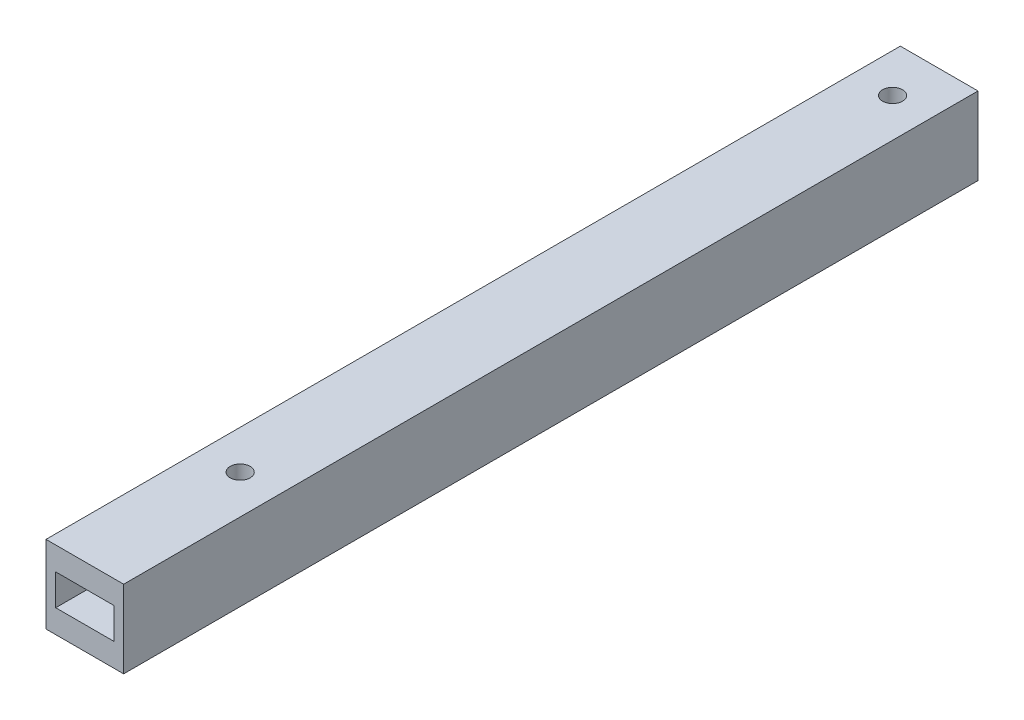
ISO-10303-21;
HEADER;
FILE_DESCRIPTION(('STEP AP214'),'2;1');
FILE_NAME('part.step','',(''),(''),'','','');
FILE_SCHEMA(('AUTOMOTIVE_DESIGN { 1 0 10303 214 1 1 1 1 }'));
ENDSEC;
DATA;
#1=APPLICATION_CONTEXT('core data for automotive mechanical design processes');
#2=APPLICATION_PROTOCOL_DEFINITION('international standard','automotive_design',2000,#1);
#3=PRODUCT_CONTEXT('',#1,'mechanical');
#4=PRODUCT('Part','Part','',(#3));
#5=PRODUCT_RELATED_PRODUCT_CATEGORY('part','',(#4));
#6=PRODUCT_DEFINITION_FORMATION('','',#4);
#7=PRODUCT_DEFINITION_CONTEXT('part definition',#1,'design');
#8=PRODUCT_DEFINITION('design','',#6,#7);
#9=PRODUCT_DEFINITION_SHAPE('','',#8);
#10=(LENGTH_UNIT() NAMED_UNIT(*) SI_UNIT(.MILLI.,.METRE.));
#11=(NAMED_UNIT(*) PLANE_ANGLE_UNIT() SI_UNIT($,.RADIAN.));
#12=(NAMED_UNIT(*) SI_UNIT($,.STERADIAN.) SOLID_ANGLE_UNIT());
#13=UNCERTAINTY_MEASURE_WITH_UNIT(LENGTH_MEASURE(1.E-05),#10,'distance_accuracy_value','');
#14=(GEOMETRIC_REPRESENTATION_CONTEXT(3) GLOBAL_UNCERTAINTY_ASSIGNED_CONTEXT((#13)) GLOBAL_UNIT_ASSIGNED_CONTEXT((#10,
#11,#12)) REPRESENTATION_CONTEXT('',''));
#15=CARTESIAN_POINT('',(0.,0.,0.));
#16=DIRECTION('',(0.,0.,1.));
#17=DIRECTION('',(1.,0.,0.));
#18=AXIS2_PLACEMENT_3D('',#15,#16,#17);
#19=CARTESIAN_POINT('',(0.,0.,279.4));
#20=DIRECTION('',(0.,0.,-1.));
#21=DIRECTION('',(-1.,0.,0.));
#22=AXIS2_PLACEMENT_3D('',#19,#20,#21);
#23=PLANE('',#22);
#24=DIRECTION('',(-1.,0.,0.));
#25=VECTOR('',#24,1.);
#26=CARTESIAN_POINT('',(12.7000000000001,-12.7,279.4));
#27=LINE('',#26,#25);
#28=CARTESIAN_POINT('',(12.7000000000001,-12.7,279.4));
#29=VERTEX_POINT('',#28);
#30=CARTESIAN_POINT('',(-12.6999999999999,-12.7,279.4));
#31=VERTEX_POINT('',#30);
#32=EDGE_CURVE('E137',#29,#31,#27,.T.);
#33=ORIENTED_EDGE('',*,*,#32,.F.);
#34=DIRECTION('',(0.,1.,0.));
#35=VECTOR('',#34,1.);
#36=CARTESIAN_POINT('',(12.7000000000001,-12.7,279.4));
#37=LINE('',#36,#35);
#38=CARTESIAN_POINT('',(12.7000000000001,12.7,279.4));
#39=VERTEX_POINT('',#38);
#40=EDGE_CURVE('E146',#29,#39,#37,.T.);
#41=ORIENTED_EDGE('',*,*,#40,.T.);
#42=DIRECTION('',(-1.,0.,0.));
#43=VECTOR('',#42,1.);
#44=CARTESIAN_POINT('',(12.7000000000001,12.7,279.4));
#45=LINE('',#44,#43);
#46=CARTESIAN_POINT('',(-12.6999999999999,12.7,279.4));
#47=VERTEX_POINT('',#46);
#48=EDGE_CURVE('E144',#39,#47,#45,.T.);
#49=ORIENTED_EDGE('',*,*,#48,.T.);
#50=DIRECTION('',(0.,1.,0.));
#51=VECTOR('',#50,1.);
#52=CARTESIAN_POINT('',(-12.6999999999999,-12.7,279.4));
#53=LINE('',#52,#51);
#54=EDGE_CURVE('E140',#31,#47,#53,.T.);
#55=ORIENTED_EDGE('',*,*,#54,.F.);
#56=EDGE_LOOP('',(#33,#41,#49,#55));
#57=FACE_BOUND('',#56,.T.);
#58=DIRECTION('',(0.,1.,0.));
#59=VECTOR('',#58,1.);
#60=CARTESIAN_POINT('',(9.52500000000005,-5.07999999999999,279.4));
#61=LINE('',#60,#59);
#62=CARTESIAN_POINT('',(9.52500000000005,-5.07999999999999,279.4));
#63=VERTEX_POINT('',#62);
#64=CARTESIAN_POINT('',(9.52500000000005,5.07999999999999,279.4));
#65=VERTEX_POINT('',#64);
#66=EDGE_CURVE('E99',#63,#65,#61,.T.);
#67=ORIENTED_EDGE('',*,*,#66,.F.);
#68=DIRECTION('',(1.,0.,0.));
#69=VECTOR('',#68,1.);
#70=CARTESIAN_POINT('',(-9.52500000000005,-5.07999999999999,279.4));
#71=LINE('',#70,#69);
#72=CARTESIAN_POINT('',(-9.52500000000005,-5.07999999999999,279.4));
#73=VERTEX_POINT('',#72);
#74=EDGE_CURVE('E121',#73,#63,#71,.T.);
#75=ORIENTED_EDGE('',*,*,#74,.F.);
#76=DIRECTION('',(0.,-1.,0.));
#77=VECTOR('',#76,1.);
#78=CARTESIAN_POINT('',(-9.52500000000005,-5.07999999999999,279.4));
#79=LINE('',#78,#77);
#80=CARTESIAN_POINT('',(-9.52500000000005,5.07999999999999,279.4));
#81=VERTEX_POINT('',#80);
#82=EDGE_CURVE('E119',#81,#73,#79,.T.);
#83=ORIENTED_EDGE('',*,*,#82,.F.);
#84=DIRECTION('',(-1.,0.,0.));
#85=VECTOR('',#84,1.);
#86=CARTESIAN_POINT('',(-9.52500000000005,5.07999999999999,279.4));
#87=LINE('',#86,#85);
#88=EDGE_CURVE('E107',#65,#81,#87,.T.);
#89=ORIENTED_EDGE('',*,*,#88,.F.);
#90=EDGE_LOOP('',(#67,#75,#83,#89));
#91=FACE_BOUND('',#90,.T.);
#92=ADVANCED_FACE('F33',(#57,#91),#23,.F.);
#93=CARTESIAN_POINT('',(0.,0.,0.));
#94=DIRECTION('',(0.,0.,-1.));
#95=DIRECTION('',(-1.,0.,0.));
#96=AXIS2_PLACEMENT_3D('',#93,#94,#95);
#97=PLANE('',#96);
#98=DIRECTION('',(-1.,0.,0.));
#99=VECTOR('',#98,1.);
#100=CARTESIAN_POINT('',(12.7000000000001,-12.7,0.));
#101=LINE('',#100,#99);
#102=CARTESIAN_POINT('',(12.7000000000001,-12.7,0.));
#103=VERTEX_POINT('',#102);
#104=CARTESIAN_POINT('',(-12.6999999999999,-12.7,0.));
#105=VERTEX_POINT('',#104);
#106=EDGE_CURVE('E115',#103,#105,#101,.T.);
#107=ORIENTED_EDGE('',*,*,#106,.T.);
#108=DIRECTION('',(0.,1.,0.));
#109=VECTOR('',#108,1.);
#110=CARTESIAN_POINT('',(-12.6999999999999,-12.7,0.));
#111=LINE('',#110,#109);
#112=CARTESIAN_POINT('',(-12.6999999999999,12.7,0.));
#113=VERTEX_POINT('',#112);
#114=EDGE_CURVE('E151',#105,#113,#111,.T.);
#115=ORIENTED_EDGE('',*,*,#114,.T.);
#116=DIRECTION('',(-1.,0.,0.));
#117=VECTOR('',#116,1.);
#118=CARTESIAN_POINT('',(12.7000000000001,12.7,0.));
#119=LINE('',#118,#117);
#120=CARTESIAN_POINT('',(12.7000000000001,12.7,0.));
#121=VERTEX_POINT('',#120);
#122=EDGE_CURVE('E154',#121,#113,#119,.T.);
#123=ORIENTED_EDGE('',*,*,#122,.F.);
#124=DIRECTION('',(0.,1.,0.));
#125=VECTOR('',#124,1.);
#126=CARTESIAN_POINT('',(12.7000000000001,-12.7,0.));
#127=LINE('',#126,#125);
#128=EDGE_CURVE('E141',#103,#121,#127,.T.);
#129=ORIENTED_EDGE('',*,*,#128,.F.);
#130=EDGE_LOOP('',(#107,#115,#123,#129));
#131=FACE_BOUND('',#130,.T.);
#132=DIRECTION('',(1.,0.,0.));
#133=VECTOR('',#132,1.);
#134=CARTESIAN_POINT('',(-9.52500000000005,-5.07999999999999,0.));
#135=LINE('',#134,#133);
#136=CARTESIAN_POINT('',(-9.52500000000005,-5.07999999999999,0.));
#137=VERTEX_POINT('',#136);
#138=CARTESIAN_POINT('',(9.52500000000005,-5.07999999999999,0.));
#139=VERTEX_POINT('',#138);
#140=EDGE_CURVE('E108',#137,#139,#135,.T.);
#141=ORIENTED_EDGE('',*,*,#140,.T.);
#142=DIRECTION('',(0.,1.,0.));
#143=VECTOR('',#142,1.);
#144=CARTESIAN_POINT('',(9.52500000000005,-5.07999999999999,0.));
#145=LINE('',#144,#143);
#146=CARTESIAN_POINT('',(9.52500000000005,5.07999999999999,0.));
#147=VERTEX_POINT('',#146);
#148=EDGE_CURVE('E58',#139,#147,#145,.T.);
#149=ORIENTED_EDGE('',*,*,#148,.T.);
#150=DIRECTION('',(-1.,0.,0.));
#151=VECTOR('',#150,1.);
#152=CARTESIAN_POINT('',(-9.52500000000005,5.07999999999999,0.));
#153=LINE('',#152,#151);
#154=CARTESIAN_POINT('',(-9.52500000000005,5.07999999999999,0.));
#155=VERTEX_POINT('',#154);
#156=EDGE_CURVE('E114',#147,#155,#153,.T.);
#157=ORIENTED_EDGE('',*,*,#156,.T.);
#158=DIRECTION('',(0.,-1.,0.));
#159=VECTOR('',#158,1.);
#160=CARTESIAN_POINT('',(-9.52500000000005,-5.07999999999999,0.));
#161=LINE('',#160,#159);
#162=EDGE_CURVE('E129',#155,#137,#161,.T.);
#163=ORIENTED_EDGE('',*,*,#162,.T.);
#164=EDGE_LOOP('',(#141,#149,#157,#163));
#165=FACE_BOUND('',#164,.T.);
#166=ADVANCED_FACE('F200',(#131,#165),#97,.T.);
#167=CARTESIAN_POINT('',(12.7000000000001,-12.7,279.4));
#168=DIRECTION('',(0.,-1.,0.));
#169=DIRECTION('',(0.,0.,-1.));
#170=AXIS2_PLACEMENT_3D('',#167,#168,#169);
#171=PLANE('',#170);
#172=CARTESIAN_POINT('',(0.,-12.7,228.6));
#173=DIRECTION('',(0.,1.,0.));
#174=DIRECTION('',(0.,0.,1.));
#175=AXIS2_PLACEMENT_3D('',#172,#173,#174);
#176=CIRCLE('',#175,3.2639);
#177=CARTESIAN_POINT('',(0.,-12.7,231.8639));
#178=VERTEX_POINT('',#177);
#179=EDGE_CURVE('E182',#178,#178,#176,.T.);
#180=ORIENTED_EDGE('',*,*,#179,.T.);
#181=EDGE_LOOP('',(#180));
#182=FACE_BOUND('',#181,.T.);
#183=CARTESIAN_POINT('',(0.,-12.7,15.24));
#184=DIRECTION('',(0.,1.,0.));
#185=DIRECTION('',(0.,0.,1.));
#186=AXIS2_PLACEMENT_3D('',#183,#184,#185);
#187=CIRCLE('',#186,3.2639);
#188=CARTESIAN_POINT('',(0.,-12.7,18.5039));
#189=VERTEX_POINT('',#188);
#190=EDGE_CURVE('E164',#189,#189,#187,.T.);
#191=ORIENTED_EDGE('',*,*,#190,.T.);
#192=EDGE_LOOP('',(#191));
#193=FACE_BOUND('',#192,.T.);
#194=ORIENTED_EDGE('',*,*,#106,.F.);
#195=DIRECTION('',(0.,0.,-1.));
#196=VECTOR('',#195,1.);
#197=CARTESIAN_POINT('',(12.7000000000001,-12.7,279.4));
#198=LINE('',#197,#196);
#199=EDGE_CURVE('E11',#29,#103,#198,.T.);
#200=ORIENTED_EDGE('',*,*,#199,.F.);
#201=ORIENTED_EDGE('',*,*,#32,.T.);
#202=DIRECTION('',(0.,0.,-1.));
#203=VECTOR('',#202,1.);
#204=CARTESIAN_POINT('',(-12.6999999999999,-12.7,279.4));
#205=LINE('',#204,#203);
#206=EDGE_CURVE('E148',#31,#105,#205,.T.);
#207=ORIENTED_EDGE('',*,*,#206,.T.);
#208=EDGE_LOOP('',(#194,#200,#201,#207));
#209=FACE_BOUND('',#208,.T.);
#210=ADVANCED_FACE('F35',(#182,#193,#209),#171,.T.);
#211=CARTESIAN_POINT('',(12.7000000000001,-12.7,279.4));
#212=DIRECTION('',(-1.,0.,0.));
#213=DIRECTION('',(0.,0.,1.));
#214=AXIS2_PLACEMENT_3D('',#211,#212,#213);
#215=PLANE('',#214);
#216=ORIENTED_EDGE('',*,*,#128,.T.);
#217=DIRECTION('',(0.,0.,-1.));
#218=VECTOR('',#217,1.);
#219=CARTESIAN_POINT('',(12.7000000000001,12.7,279.4));
#220=LINE('',#219,#218);
#221=EDGE_CURVE('E42',#39,#121,#220,.T.);
#222=ORIENTED_EDGE('',*,*,#221,.F.);
#223=ORIENTED_EDGE('',*,*,#40,.F.);
#224=ORIENTED_EDGE('',*,*,#199,.T.);
#225=EDGE_LOOP('',(#216,#222,#223,#224));
#226=FACE_BOUND('',#225,.T.);
#227=ADVANCED_FACE('F220',(#226),#215,.F.);
#228=CARTESIAN_POINT('',(12.7000000000001,12.7,279.4));
#229=DIRECTION('',(0.,-1.,0.));
#230=DIRECTION('',(0.,0.,-1.));
#231=AXIS2_PLACEMENT_3D('',#228,#229,#230);
#232=PLANE('',#231);
#233=CARTESIAN_POINT('',(0.,12.7,228.6));
#234=DIRECTION('',(0.,1.,0.));
#235=DIRECTION('',(0.,0.,1.));
#236=AXIS2_PLACEMENT_3D('',#233,#234,#235);
#237=CIRCLE('',#236,3.2639);
#238=CARTESIAN_POINT('',(0.,12.7,231.8639));
#239=VERTEX_POINT('',#238);
#240=EDGE_CURVE('E179',#239,#239,#237,.T.);
#241=ORIENTED_EDGE('',*,*,#240,.F.);
#242=EDGE_LOOP('',(#241));
#243=FACE_BOUND('',#242,.T.);
#244=CARTESIAN_POINT('',(0.,12.7,15.24));
#245=DIRECTION('',(0.,1.,0.));
#246=DIRECTION('',(0.,0.,1.));
#247=AXIS2_PLACEMENT_3D('',#244,#245,#246);
#248=CIRCLE('',#247,3.2639);
#249=CARTESIAN_POINT('',(0.,12.7,18.5039));
#250=VERTEX_POINT('',#249);
#251=EDGE_CURVE('E169',#250,#250,#248,.T.);
#252=ORIENTED_EDGE('',*,*,#251,.F.);
#253=EDGE_LOOP('',(#252));
#254=FACE_BOUND('',#253,.T.);
#255=ORIENTED_EDGE('',*,*,#122,.T.);
#256=DIRECTION('',(0.,0.,-1.));
#257=VECTOR('',#256,1.);
#258=CARTESIAN_POINT('',(-12.6999999999999,12.7,279.4));
#259=LINE('',#258,#257);
#260=EDGE_CURVE('E160',#47,#113,#259,.T.);
#261=ORIENTED_EDGE('',*,*,#260,.F.);
#262=ORIENTED_EDGE('',*,*,#48,.F.);
#263=ORIENTED_EDGE('',*,*,#221,.T.);
#264=EDGE_LOOP('',(#255,#261,#262,#263));
#265=FACE_BOUND('',#264,.T.);
#266=ADVANCED_FACE('F223',(#243,#254,#265),#232,.F.);
#267=CARTESIAN_POINT('',(-12.6999999999999,-12.7,279.4));
#268=DIRECTION('',(-1.,0.,0.));
#269=DIRECTION('',(0.,0.,1.));
#270=AXIS2_PLACEMENT_3D('',#267,#268,#269);
#271=PLANE('',#270);
#272=ORIENTED_EDGE('',*,*,#114,.F.);
#273=ORIENTED_EDGE('',*,*,#206,.F.);
#274=ORIENTED_EDGE('',*,*,#54,.T.);
#275=ORIENTED_EDGE('',*,*,#260,.T.);
#276=EDGE_LOOP('',(#272,#273,#274,#275));
#277=FACE_BOUND('',#276,.T.);
#278=ADVANCED_FACE('F226',(#277),#271,.T.);
#279=CARTESIAN_POINT('',(9.52500000000005,-5.07999999999999,279.4));
#280=DIRECTION('',(-1.,0.,0.));
#281=DIRECTION('',(0.,0.,1.));
#282=AXIS2_PLACEMENT_3D('',#279,#280,#281);
#283=PLANE('',#282);
#284=ORIENTED_EDGE('',*,*,#148,.F.);
#285=DIRECTION('',(0.,0.,-1.));
#286=VECTOR('',#285,1.);
#287=CARTESIAN_POINT('',(9.52500000000005,-5.07999999999999,279.4));
#288=LINE('',#287,#286);
#289=EDGE_CURVE('E103',#63,#139,#288,.T.);
#290=ORIENTED_EDGE('',*,*,#289,.F.);
#291=ORIENTED_EDGE('',*,*,#66,.T.);
#292=DIRECTION('',(0.,0.,-1.));
#293=VECTOR('',#292,1.);
#294=CARTESIAN_POINT('',(9.52500000000005,5.07999999999999,279.4));
#295=LINE('',#294,#293);
#296=EDGE_CURVE('E102',#65,#147,#295,.T.);
#297=ORIENTED_EDGE('',*,*,#296,.T.);
#298=EDGE_LOOP('',(#284,#290,#291,#297));
#299=FACE_BOUND('',#298,.T.);
#300=ADVANCED_FACE('F101',(#299),#283,.T.);
#301=CARTESIAN_POINT('',(-9.52500000000005,5.07999999999999,279.4));
#302=DIRECTION('',(0.,-1.,0.));
#303=DIRECTION('',(0.,0.,-1.));
#304=AXIS2_PLACEMENT_3D('',#301,#302,#303);
#305=PLANE('',#304);
#306=CARTESIAN_POINT('',(0.,5.07999999999999,228.6));
#307=DIRECTION('',(0.,-1.,0.));
#308=DIRECTION('',(0.,0.,-1.));
#309=AXIS2_PLACEMENT_3D('',#306,#307,#308);
#310=CIRCLE('',#309,3.2639);
#311=CARTESIAN_POINT('',(0.,5.07999999999999,225.3361));
#312=VERTEX_POINT('',#311);
#313=EDGE_CURVE('E174',#312,#312,#310,.T.);
#314=ORIENTED_EDGE('',*,*,#313,.F.);
#315=EDGE_LOOP('',(#314));
#316=FACE_BOUND('',#315,.T.);
#317=CARTESIAN_POINT('',(0.,5.07999999999999,15.24));
#318=DIRECTION('',(0.,-1.,0.));
#319=DIRECTION('',(0.,0.,-1.));
#320=AXIS2_PLACEMENT_3D('',#317,#318,#319);
#321=CIRCLE('',#320,3.2639);
#322=CARTESIAN_POINT('',(0.,5.07999999999999,11.9761));
#323=VERTEX_POINT('',#322);
#324=EDGE_CURVE('E127',#323,#323,#321,.T.);
#325=ORIENTED_EDGE('',*,*,#324,.F.);
#326=EDGE_LOOP('',(#325));
#327=FACE_BOUND('',#326,.T.);
#328=ORIENTED_EDGE('',*,*,#156,.F.);
#329=ORIENTED_EDGE('',*,*,#296,.F.);
#330=ORIENTED_EDGE('',*,*,#88,.T.);
#331=DIRECTION('',(0.,0.,-1.));
#332=VECTOR('',#331,1.);
#333=CARTESIAN_POINT('',(-9.52500000000005,5.07999999999999,279.4));
#334=LINE('',#333,#332);
#335=EDGE_CURVE('E116',#81,#155,#334,.T.);
#336=ORIENTED_EDGE('',*,*,#335,.T.);
#337=EDGE_LOOP('',(#328,#329,#330,#336));
#338=FACE_BOUND('',#337,.T.);
#339=ADVANCED_FACE('F111',(#316,#327,#338),#305,.T.);
#340=CARTESIAN_POINT('',(-9.52500000000005,-5.07999999999999,279.4));
#341=DIRECTION('',(1.,0.,0.));
#342=DIRECTION('',(0.,0.,-1.));
#343=AXIS2_PLACEMENT_3D('',#340,#341,#342);
#344=PLANE('',#343);
#345=ORIENTED_EDGE('',*,*,#162,.F.);
#346=ORIENTED_EDGE('',*,*,#335,.F.);
#347=ORIENTED_EDGE('',*,*,#82,.T.);
#348=DIRECTION('',(0.,0.,-1.));
#349=VECTOR('',#348,1.);
#350=CARTESIAN_POINT('',(-9.52500000000005,-5.07999999999999,279.4));
#351=LINE('',#350,#349);
#352=EDGE_CURVE('E50',#73,#137,#351,.T.);
#353=ORIENTED_EDGE('',*,*,#352,.T.);
#354=EDGE_LOOP('',(#345,#346,#347,#353));
#355=FACE_BOUND('',#354,.T.);
#356=ADVANCED_FACE('F196',(#355),#344,.T.);
#357=CARTESIAN_POINT('',(-9.52500000000005,-5.07999999999999,279.4));
#358=DIRECTION('',(0.,1.,0.));
#359=DIRECTION('',(0.,0.,1.));
#360=AXIS2_PLACEMENT_3D('',#357,#358,#359);
#361=PLANE('',#360);
#362=CARTESIAN_POINT('',(0.,-5.07999999999999,228.6));
#363=DIRECTION('',(0.,1.,0.));
#364=DIRECTION('',(0.,0.,1.));
#365=AXIS2_PLACEMENT_3D('',#362,#363,#364);
#366=CIRCLE('',#365,3.2639);
#367=CARTESIAN_POINT('',(0.,-5.07999999999999,231.8639));
#368=VERTEX_POINT('',#367);
#369=EDGE_CURVE('E37',#368,#368,#366,.T.);
#370=ORIENTED_EDGE('',*,*,#369,.F.);
#371=EDGE_LOOP('',(#370));
#372=FACE_BOUND('',#371,.T.);
#373=CARTESIAN_POINT('',(0.,-5.07999999999999,15.24));
#374=DIRECTION('',(0.,1.,0.));
#375=DIRECTION('',(0.,0.,1.));
#376=AXIS2_PLACEMENT_3D('',#373,#374,#375);
#377=CIRCLE('',#376,3.2639);
#378=CARTESIAN_POINT('',(0.,-5.07999999999999,18.5039));
#379=VERTEX_POINT('',#378);
#380=EDGE_CURVE('E162',#379,#379,#377,.T.);
#381=ORIENTED_EDGE('',*,*,#380,.F.);
#382=EDGE_LOOP('',(#381));
#383=FACE_BOUND('',#382,.T.);
#384=ORIENTED_EDGE('',*,*,#140,.F.);
#385=ORIENTED_EDGE('',*,*,#352,.F.);
#386=ORIENTED_EDGE('',*,*,#74,.T.);
#387=ORIENTED_EDGE('',*,*,#289,.T.);
#388=EDGE_LOOP('',(#384,#385,#386,#387));
#389=FACE_BOUND('',#388,.T.);
#390=ADVANCED_FACE('F192',(#372,#383,#389),#361,.T.);
#391=CARTESIAN_POINT('',(0.,-12.7,15.24));
#392=DIRECTION('',(0.,1.,0.));
#393=DIRECTION('',(0.,0.,1.));
#394=AXIS2_PLACEMENT_3D('',#391,#392,#393);
#395=CYLINDRICAL_SURFACE('',#394,3.2639);
#396=ORIENTED_EDGE('',*,*,#380,.T.);
#397=EDGE_LOOP('',(#396));
#398=FACE_BOUND('',#397,.T.);
#399=ORIENTED_EDGE('',*,*,#190,.F.);
#400=EDGE_LOOP('',(#399));
#401=FACE_BOUND('',#400,.T.);
#402=ADVANCED_FACE('F195',(#398,#401),#395,.F.);
#403=ORIENTED_EDGE('',*,*,#324,.T.);
#404=EDGE_LOOP('',(#403));
#405=FACE_BOUND('',#404,.T.);
#406=ORIENTED_EDGE('',*,*,#251,.T.);
#407=EDGE_LOOP('',(#406));
#408=FACE_BOUND('',#407,.T.);
#409=ADVANCED_FACE('F285',(#405,#408),#395,.F.);
#410=CARTESIAN_POINT('',(0.,-12.7,228.6));
#411=DIRECTION('',(0.,1.,0.));
#412=DIRECTION('',(0.,0.,1.));
#413=AXIS2_PLACEMENT_3D('',#410,#411,#412);
#414=CYLINDRICAL_SURFACE('',#413,3.2639);
#415=ORIENTED_EDGE('',*,*,#369,.T.);
#416=EDGE_LOOP('',(#415));
#417=FACE_BOUND('',#416,.T.);
#418=ORIENTED_EDGE('',*,*,#179,.F.);
#419=EDGE_LOOP('',(#418));
#420=FACE_BOUND('',#419,.T.);
#421=ADVANCED_FACE('F189',(#417,#420),#414,.F.);
#422=ORIENTED_EDGE('',*,*,#313,.T.);
#423=EDGE_LOOP('',(#422));
#424=FACE_BOUND('',#423,.T.);
#425=ORIENTED_EDGE('',*,*,#240,.T.);
#426=EDGE_LOOP('',(#425));
#427=FACE_BOUND('',#426,.T.);
#428=ADVANCED_FACE('F284',(#424,#427),#414,.F.);
#429=CLOSED_SHELL('',(#92,#166,#210,#227,#266,#278,#300,#339,#356,#390,#402,#409,#421,#428));
#430=MANIFOLD_SOLID_BREP('B2',#429);
#431=ADVANCED_BREP_SHAPE_REPRESENTATION('',(#18,#430),#14);
#432=SHAPE_DEFINITION_REPRESENTATION(#9,#431);
ENDSEC;
END-ISO-10303-21;
